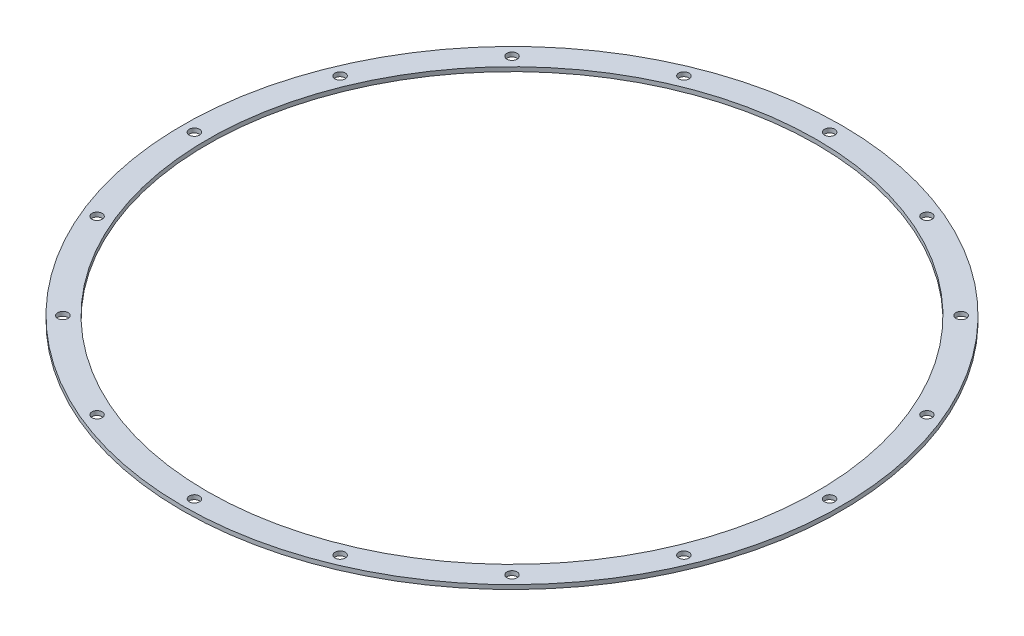
ISO-10303-21;
HEADER;
FILE_DESCRIPTION(('STEP AP214'),'2;1');
FILE_NAME('part.step','',(''),(''),'','','');
FILE_SCHEMA(('AUTOMOTIVE_DESIGN { 1 0 10303 214 1 1 1 1 }'));
ENDSEC;
DATA;
#1=APPLICATION_CONTEXT('core data for automotive mechanical design processes');
#2=APPLICATION_PROTOCOL_DEFINITION('international standard','automotive_design',2000,#1);
#3=PRODUCT_CONTEXT('',#1,'mechanical');
#4=PRODUCT('Part','Part','',(#3));
#5=PRODUCT_RELATED_PRODUCT_CATEGORY('part','',(#4));
#6=PRODUCT_DEFINITION_FORMATION('','',#4);
#7=PRODUCT_DEFINITION_CONTEXT('part definition',#1,'design');
#8=PRODUCT_DEFINITION('design','',#6,#7);
#9=PRODUCT_DEFINITION_SHAPE('','',#8);
#10=(LENGTH_UNIT() NAMED_UNIT(*) SI_UNIT(.MILLI.,.METRE.));
#11=(NAMED_UNIT(*) PLANE_ANGLE_UNIT() SI_UNIT($,.RADIAN.));
#12=(NAMED_UNIT(*) SI_UNIT($,.STERADIAN.) SOLID_ANGLE_UNIT());
#13=UNCERTAINTY_MEASURE_WITH_UNIT(LENGTH_MEASURE(1.E-05),#10,'distance_accuracy_value','');
#14=(GEOMETRIC_REPRESENTATION_CONTEXT(3) GLOBAL_UNCERTAINTY_ASSIGNED_CONTEXT((#13)) GLOBAL_UNIT_ASSIGNED_CONTEXT((#10,
#11,#12)) REPRESENTATION_CONTEXT('',''));
#15=CARTESIAN_POINT('',(0.,0.,0.));
#16=DIRECTION('',(0.,0.,1.));
#17=DIRECTION('',(1.,0.,0.));
#18=AXIS2_PLACEMENT_3D('',#15,#16,#17);
#19=CARTESIAN_POINT('',(0.,2.5,0.));
#20=DIRECTION('',(0.,1.,0.));
#21=DIRECTION('',(0.,0.,1.));
#22=AXIS2_PLACEMENT_3D('',#19,#20,#21);
#23=PLANE('',#22);
#24=CARTESIAN_POINT('',(-262.690169210806,2.5,262.690169210799));
#25=DIRECTION('',(0.,1.,0.));
#26=DIRECTION('',(0.,0.,1.));
#27=AXIS2_PLACEMENT_3D('',#24,#25,#26);
#28=CIRCLE('',#27,5.99999999999999);
#29=CARTESIAN_POINT('',(-262.690169210806,2.5,268.690169210799));
#30=VERTEX_POINT('',#29);
#31=EDGE_CURVE('E133',#30,#30,#28,.T.);
#32=ORIENTED_EDGE('',*,*,#31,.F.);
#33=EDGE_LOOP('',(#32));
#34=FACE_BOUND('',#33,.T.);
#35=CARTESIAN_POINT('',(-3.89125595214067E-12,2.5,371.5));
#36=DIRECTION('',(0.,1.,0.));
#37=DIRECTION('',(0.,0.,1.));
#38=AXIS2_PLACEMENT_3D('',#35,#36,#37);
#39=CIRCLE('',#38,5.99999999999997);
#40=CARTESIAN_POINT('',(-3.89125595214067E-12,2.5,377.5));
#41=VERTEX_POINT('',#40);
#42=EDGE_CURVE('E121',#41,#41,#39,.T.);
#43=ORIENTED_EDGE('',*,*,#42,.F.);
#44=EDGE_LOOP('',(#43));
#45=FACE_BOUND('',#44,.T.);
#46=CARTESIAN_POINT('',(262.6901692108,2.5,262.690169210805));
#47=DIRECTION('',(0.,1.,0.));
#48=DIRECTION('',(0.,0.,1.));
#49=AXIS2_PLACEMENT_3D('',#46,#47,#48);
#50=CIRCLE('',#49,5.99999999999998);
#51=CARTESIAN_POINT('',(262.6901692108,2.5,268.690169210805));
#52=VERTEX_POINT('',#51);
#53=EDGE_CURVE('E109',#52,#52,#50,.T.);
#54=ORIENTED_EDGE('',*,*,#53,.F.);
#55=EDGE_LOOP('',(#54));
#56=FACE_BOUND('',#55,.T.);
#57=CARTESIAN_POINT('',(371.5,2.5,2.59417063476045E-12));
#58=DIRECTION('',(0.,1.,0.));
#59=DIRECTION('',(0.,0.,1.));
#60=AXIS2_PLACEMENT_3D('',#57,#58,#59);
#61=CIRCLE('',#60,5.99999999999998);
#62=CARTESIAN_POINT('',(371.5,2.5,6.00000000000257));
#63=VERTEX_POINT('',#62);
#64=EDGE_CURVE('E97',#63,#63,#61,.T.);
#65=ORIENTED_EDGE('',*,*,#64,.F.);
#66=EDGE_LOOP('',(#65));
#67=FACE_BOUND('',#66,.T.);
#68=CARTESIAN_POINT('',(262.690169210804,2.5,-262.690169210801));
#69=DIRECTION('',(0.,1.,0.));
#70=DIRECTION('',(0.,0.,1.));
#71=AXIS2_PLACEMENT_3D('',#68,#69,#70);
#72=CIRCLE('',#71,5.99999999999998);
#73=CARTESIAN_POINT('',(262.690169210804,2.5,-256.690169210801));
#74=VERTEX_POINT('',#73);
#75=EDGE_CURVE('E85',#74,#74,#72,.T.);
#76=ORIENTED_EDGE('',*,*,#75,.F.);
#77=EDGE_LOOP('',(#76));
#78=FACE_BOUND('',#77,.T.);
#79=CARTESIAN_POINT('',(1.29708531738022E-12,2.5,-371.5));
#80=DIRECTION('',(0.,1.,0.));
#81=DIRECTION('',(0.,0.,1.));
#82=AXIS2_PLACEMENT_3D('',#79,#80,#81);
#83=CIRCLE('',#82,5.99999999999998);
#84=CARTESIAN_POINT('',(1.29708531738022E-12,2.5,-365.5));
#85=VERTEX_POINT('',#84);
#86=EDGE_CURVE('E73',#85,#85,#83,.T.);
#87=ORIENTED_EDGE('',*,*,#86,.F.);
#88=EDGE_LOOP('',(#87));
#89=FACE_BOUND('',#88,.T.);
#90=CARTESIAN_POINT('',(-262.690169210802,2.5,-262.690169210803));
#91=DIRECTION('',(0.,1.,0.));
#92=DIRECTION('',(0.,0.,1.));
#93=AXIS2_PLACEMENT_3D('',#90,#91,#92);
#94=CIRCLE('',#93,5.99999999999996);
#95=CARTESIAN_POINT('',(-262.690169210802,2.5,-256.690169210803));
#96=VERTEX_POINT('',#95);
#97=EDGE_CURVE('E61',#96,#96,#94,.T.);
#98=ORIENTED_EDGE('',*,*,#97,.F.);
#99=EDGE_LOOP('',(#98));
#100=FACE_BOUND('',#99,.T.);
#101=CARTESIAN_POINT('',(-371.5,2.5,0.));
#102=DIRECTION('',(0.,1.,0.));
#103=DIRECTION('',(0.,0.,1.));
#104=AXIS2_PLACEMENT_3D('',#101,#102,#103);
#105=CIRCLE('',#104,5.99999999999999);
#106=CARTESIAN_POINT('',(-371.5,2.5,5.99999999999999));
#107=VERTEX_POINT('',#106);
#108=EDGE_CURVE('E49',#107,#107,#105,.T.);
#109=ORIENTED_EDGE('',*,*,#108,.F.);
#110=EDGE_LOOP('',(#109));
#111=FACE_BOUND('',#110,.T.);
#112=CARTESIAN_POINT('',(0.,2.5,0.));
#113=DIRECTION('',(0.,1.,0.));
#114=DIRECTION('',(0.,0.,1.));
#115=AXIS2_PLACEMENT_3D('',#112,#113,#114);
#116=CIRCLE('',#115,385.5);
#117=CARTESIAN_POINT('',(0.,2.5,385.5));
#118=VERTEX_POINT('',#117);
#119=EDGE_CURVE('E10',#118,#118,#116,.T.);
#120=ORIENTED_EDGE('',*,*,#119,.T.);
#121=EDGE_LOOP('',(#120));
#122=FACE_BOUND('',#121,.T.);
#123=CARTESIAN_POINT('',(0.,2.5,0.));
#124=DIRECTION('',(0.,1.,0.));
#125=DIRECTION('',(0.,0.,1.));
#126=AXIS2_PLACEMENT_3D('',#123,#124,#125);
#127=CIRCLE('',#126,356.5);
#128=CARTESIAN_POINT('',(0.,2.5,356.5));
#129=VERTEX_POINT('',#128);
#130=EDGE_CURVE('E44',#129,#129,#127,.T.);
#131=ORIENTED_EDGE('',*,*,#130,.F.);
#132=EDGE_LOOP('',(#131));
#133=FACE_BOUND('',#132,.T.);
#134=CARTESIAN_POINT('',(-343.221246327943,2.5,-142.166895123631));
#135=DIRECTION('',(0.,1.,0.));
#136=DIRECTION('',(0.,0.,1.));
#137=AXIS2_PLACEMENT_3D('',#134,#135,#136);
#138=CIRCLE('',#137,5.99999999999998);
#139=CARTESIAN_POINT('',(-343.221246327943,2.5,-136.166895123631));
#140=VERTEX_POINT('',#139);
#141=EDGE_CURVE('E55',#140,#140,#138,.T.);
#142=ORIENTED_EDGE('',*,*,#141,.F.);
#143=EDGE_LOOP('',(#142));
#144=FACE_BOUND('',#143,.T.);
#145=CARTESIAN_POINT('',(-142.16689512363,2.5,-343.221246327943));
#146=DIRECTION('',(0.,1.,0.));
#147=DIRECTION('',(0.,0.,1.));
#148=AXIS2_PLACEMENT_3D('',#145,#146,#147);
#149=CIRCLE('',#148,5.99999999999998);
#150=CARTESIAN_POINT('',(-142.16689512363,2.5,-337.221246327943));
#151=VERTEX_POINT('',#150);
#152=EDGE_CURVE('E67',#151,#151,#149,.T.);
#153=ORIENTED_EDGE('',*,*,#152,.F.);
#154=EDGE_LOOP('',(#153));
#155=FACE_BOUND('',#154,.T.);
#156=CARTESIAN_POINT('',(142.166895123632,2.5,-343.221246327942));
#157=DIRECTION('',(0.,1.,0.));
#158=DIRECTION('',(0.,0.,1.));
#159=AXIS2_PLACEMENT_3D('',#156,#157,#158);
#160=CIRCLE('',#159,5.99999999999998);
#161=CARTESIAN_POINT('',(142.166895123632,2.5,-337.221246327942));
#162=VERTEX_POINT('',#161);
#163=EDGE_CURVE('E79',#162,#162,#160,.T.);
#164=ORIENTED_EDGE('',*,*,#163,.F.);
#165=EDGE_LOOP('',(#164));
#166=FACE_BOUND('',#165,.T.);
#167=CARTESIAN_POINT('',(343.221246327944,2.5,-142.166895123629));
#168=DIRECTION('',(0.,1.,0.));
#169=DIRECTION('',(0.,0.,1.));
#170=AXIS2_PLACEMENT_3D('',#167,#168,#169);
#171=CIRCLE('',#170,5.99999999999998);
#172=CARTESIAN_POINT('',(343.221246327944,2.5,-136.166895123629));
#173=VERTEX_POINT('',#172);
#174=EDGE_CURVE('E91',#173,#173,#171,.T.);
#175=ORIENTED_EDGE('',*,*,#174,.F.);
#176=EDGE_LOOP('',(#175));
#177=FACE_BOUND('',#176,.T.);
#178=CARTESIAN_POINT('',(343.221246327942,2.5,142.166895123634));
#179=DIRECTION('',(0.,1.,0.));
#180=DIRECTION('',(0.,0.,1.));
#181=AXIS2_PLACEMENT_3D('',#178,#179,#180);
#182=CIRCLE('',#181,5.99999999999998);
#183=CARTESIAN_POINT('',(343.221246327942,2.5,148.166895123634));
#184=VERTEX_POINT('',#183);
#185=EDGE_CURVE('E103',#184,#184,#182,.T.);
#186=ORIENTED_EDGE('',*,*,#185,.F.);
#187=EDGE_LOOP('',(#186));
#188=FACE_BOUND('',#187,.T.);
#189=CARTESIAN_POINT('',(142.166895123627,2.5,343.221246327944));
#190=DIRECTION('',(0.,1.,0.));
#191=DIRECTION('',(0.,0.,1.));
#192=AXIS2_PLACEMENT_3D('',#189,#190,#191);
#193=CIRCLE('',#192,6.);
#194=CARTESIAN_POINT('',(142.166895123627,2.5,349.221246327944));
#195=VERTEX_POINT('',#194);
#196=EDGE_CURVE('E115',#195,#195,#193,.T.);
#197=ORIENTED_EDGE('',*,*,#196,.F.);
#198=EDGE_LOOP('',(#197));
#199=FACE_BOUND('',#198,.T.);
#200=CARTESIAN_POINT('',(-142.166895123635,2.5,343.221246327942));
#201=DIRECTION('',(0.,1.,0.));
#202=DIRECTION('',(0.,0.,1.));
#203=AXIS2_PLACEMENT_3D('',#200,#201,#202);
#204=CIRCLE('',#203,5.99999999999998);
#205=CARTESIAN_POINT('',(-142.166895123635,2.5,349.221246327942));
#206=VERTEX_POINT('',#205);
#207=EDGE_CURVE('E127',#206,#206,#204,.T.);
#208=ORIENTED_EDGE('',*,*,#207,.F.);
#209=EDGE_LOOP('',(#208));
#210=FACE_BOUND('',#209,.T.);
#211=CARTESIAN_POINT('',(-343.221246327945,2.5,142.166895123626));
#212=DIRECTION('',(0.,1.,0.));
#213=DIRECTION('',(0.,0.,1.));
#214=AXIS2_PLACEMENT_3D('',#211,#212,#213);
#215=CIRCLE('',#214,5.99999999999998);
#216=CARTESIAN_POINT('',(-343.221246327945,2.5,148.166895123626));
#217=VERTEX_POINT('',#216);
#218=EDGE_CURVE('E139',#217,#217,#215,.T.);
#219=ORIENTED_EDGE('',*,*,#218,.F.);
#220=EDGE_LOOP('',(#219));
#221=FACE_BOUND('',#220,.T.);
#222=ADVANCED_FACE('F33',(#34,#45,#56,#67,#78,#89,#100,#111,#122,#133,#144,#155,#166,#177,#188,
#199,#210,#221),#23,.T.);
#223=CARTESIAN_POINT('',(0.,-2.5,0.));
#224=DIRECTION('',(0.,1.,0.));
#225=DIRECTION('',(0.,0.,1.));
#226=AXIS2_PLACEMENT_3D('',#223,#224,#225);
#227=PLANE('',#226);
#228=CARTESIAN_POINT('',(0.,-2.5,0.));
#229=DIRECTION('',(0.,1.,0.));
#230=DIRECTION('',(0.,0.,1.));
#231=AXIS2_PLACEMENT_3D('',#228,#229,#230);
#232=CIRCLE('',#231,385.5);
#233=CARTESIAN_POINT('',(0.,-2.5,385.5));
#234=VERTEX_POINT('',#233);
#235=EDGE_CURVE('E37',#234,#234,#232,.T.);
#236=ORIENTED_EDGE('',*,*,#235,.F.);
#237=EDGE_LOOP('',(#236));
#238=FACE_BOUND('',#237,.T.);
#239=CARTESIAN_POINT('',(0.,-2.5,0.));
#240=DIRECTION('',(0.,1.,0.));
#241=DIRECTION('',(0.,0.,1.));
#242=AXIS2_PLACEMENT_3D('',#239,#240,#241);
#243=CIRCLE('',#242,356.5);
#244=CARTESIAN_POINT('',(0.,-2.5,356.5));
#245=VERTEX_POINT('',#244);
#246=EDGE_CURVE('E46',#245,#245,#243,.T.);
#247=ORIENTED_EDGE('',*,*,#246,.T.);
#248=EDGE_LOOP('',(#247));
#249=FACE_BOUND('',#248,.T.);
#250=CARTESIAN_POINT('',(-371.5,-2.5,0.));
#251=DIRECTION('',(0.,1.,0.));
#252=DIRECTION('',(0.,0.,1.));
#253=AXIS2_PLACEMENT_3D('',#250,#251,#252);
#254=CIRCLE('',#253,5.99999999999999);
#255=CARTESIAN_POINT('',(-371.5,-2.5,5.99999999999999));
#256=VERTEX_POINT('',#255);
#257=EDGE_CURVE('E52',#256,#256,#254,.T.);
#258=ORIENTED_EDGE('',*,*,#257,.T.);
#259=EDGE_LOOP('',(#258));
#260=FACE_BOUND('',#259,.T.);
#261=CARTESIAN_POINT('',(-343.221246327943,-2.5,-142.166895123631));
#262=DIRECTION('',(0.,1.,0.));
#263=DIRECTION('',(0.,0.,1.));
#264=AXIS2_PLACEMENT_3D('',#261,#262,#263);
#265=CIRCLE('',#264,5.99999999999998);
#266=CARTESIAN_POINT('',(-343.221246327943,-2.5,-136.166895123631));
#267=VERTEX_POINT('',#266);
#268=EDGE_CURVE('E58',#267,#267,#265,.T.);
#269=ORIENTED_EDGE('',*,*,#268,.T.);
#270=EDGE_LOOP('',(#269));
#271=FACE_BOUND('',#270,.T.);
#272=CARTESIAN_POINT('',(-262.690169210802,-2.5,-262.690169210803));
#273=DIRECTION('',(0.,1.,0.));
#274=DIRECTION('',(0.,0.,1.));
#275=AXIS2_PLACEMENT_3D('',#272,#273,#274);
#276=CIRCLE('',#275,5.99999999999996);
#277=CARTESIAN_POINT('',(-262.690169210802,-2.5,-256.690169210803));
#278=VERTEX_POINT('',#277);
#279=EDGE_CURVE('E64',#278,#278,#276,.T.);
#280=ORIENTED_EDGE('',*,*,#279,.T.);
#281=EDGE_LOOP('',(#280));
#282=FACE_BOUND('',#281,.T.);
#283=CARTESIAN_POINT('',(-142.16689512363,-2.5,-343.221246327943));
#284=DIRECTION('',(0.,1.,0.));
#285=DIRECTION('',(0.,0.,1.));
#286=AXIS2_PLACEMENT_3D('',#283,#284,#285);
#287=CIRCLE('',#286,5.99999999999998);
#288=CARTESIAN_POINT('',(-142.16689512363,-2.5,-337.221246327943));
#289=VERTEX_POINT('',#288);
#290=EDGE_CURVE('E70',#289,#289,#287,.T.);
#291=ORIENTED_EDGE('',*,*,#290,.T.);
#292=EDGE_LOOP('',(#291));
#293=FACE_BOUND('',#292,.T.);
#294=CARTESIAN_POINT('',(1.29708531738022E-12,-2.5,-371.5));
#295=DIRECTION('',(0.,1.,0.));
#296=DIRECTION('',(0.,0.,1.));
#297=AXIS2_PLACEMENT_3D('',#294,#295,#296);
#298=CIRCLE('',#297,5.99999999999998);
#299=CARTESIAN_POINT('',(1.29708531738022E-12,-2.5,-365.5));
#300=VERTEX_POINT('',#299);
#301=EDGE_CURVE('E76',#300,#300,#298,.T.);
#302=ORIENTED_EDGE('',*,*,#301,.T.);
#303=EDGE_LOOP('',(#302));
#304=FACE_BOUND('',#303,.T.);
#305=CARTESIAN_POINT('',(142.166895123632,-2.5,-343.221246327942));
#306=DIRECTION('',(0.,1.,0.));
#307=DIRECTION('',(0.,0.,1.));
#308=AXIS2_PLACEMENT_3D('',#305,#306,#307);
#309=CIRCLE('',#308,5.99999999999998);
#310=CARTESIAN_POINT('',(142.166895123632,-2.5,-337.221246327942));
#311=VERTEX_POINT('',#310);
#312=EDGE_CURVE('E82',#311,#311,#309,.T.);
#313=ORIENTED_EDGE('',*,*,#312,.T.);
#314=EDGE_LOOP('',(#313));
#315=FACE_BOUND('',#314,.T.);
#316=CARTESIAN_POINT('',(262.690169210804,-2.5,-262.690169210801));
#317=DIRECTION('',(0.,1.,0.));
#318=DIRECTION('',(0.,0.,1.));
#319=AXIS2_PLACEMENT_3D('',#316,#317,#318);
#320=CIRCLE('',#319,5.99999999999998);
#321=CARTESIAN_POINT('',(262.690169210804,-2.5,-256.690169210801));
#322=VERTEX_POINT('',#321);
#323=EDGE_CURVE('E88',#322,#322,#320,.T.);
#324=ORIENTED_EDGE('',*,*,#323,.T.);
#325=EDGE_LOOP('',(#324));
#326=FACE_BOUND('',#325,.T.);
#327=CARTESIAN_POINT('',(343.221246327944,-2.5,-142.166895123629));
#328=DIRECTION('',(0.,1.,0.));
#329=DIRECTION('',(0.,0.,1.));
#330=AXIS2_PLACEMENT_3D('',#327,#328,#329);
#331=CIRCLE('',#330,5.99999999999998);
#332=CARTESIAN_POINT('',(343.221246327944,-2.5,-136.166895123629));
#333=VERTEX_POINT('',#332);
#334=EDGE_CURVE('E94',#333,#333,#331,.T.);
#335=ORIENTED_EDGE('',*,*,#334,.T.);
#336=EDGE_LOOP('',(#335));
#337=FACE_BOUND('',#336,.T.);
#338=CARTESIAN_POINT('',(371.5,-2.5,2.59417063476045E-12));
#339=DIRECTION('',(0.,1.,0.));
#340=DIRECTION('',(0.,0.,1.));
#341=AXIS2_PLACEMENT_3D('',#338,#339,#340);
#342=CIRCLE('',#341,5.99999999999998);
#343=CARTESIAN_POINT('',(371.5,-2.5,6.00000000000257));
#344=VERTEX_POINT('',#343);
#345=EDGE_CURVE('E100',#344,#344,#342,.T.);
#346=ORIENTED_EDGE('',*,*,#345,.T.);
#347=EDGE_LOOP('',(#346));
#348=FACE_BOUND('',#347,.T.);
#349=CARTESIAN_POINT('',(343.221246327942,-2.5,142.166895123634));
#350=DIRECTION('',(0.,1.,0.));
#351=DIRECTION('',(0.,0.,1.));
#352=AXIS2_PLACEMENT_3D('',#349,#350,#351);
#353=CIRCLE('',#352,5.99999999999998);
#354=CARTESIAN_POINT('',(343.221246327942,-2.5,148.166895123634));
#355=VERTEX_POINT('',#354);
#356=EDGE_CURVE('E106',#355,#355,#353,.T.);
#357=ORIENTED_EDGE('',*,*,#356,.T.);
#358=EDGE_LOOP('',(#357));
#359=FACE_BOUND('',#358,.T.);
#360=CARTESIAN_POINT('',(262.6901692108,-2.5,262.690169210805));
#361=DIRECTION('',(0.,1.,0.));
#362=DIRECTION('',(0.,0.,1.));
#363=AXIS2_PLACEMENT_3D('',#360,#361,#362);
#364=CIRCLE('',#363,5.99999999999998);
#365=CARTESIAN_POINT('',(262.6901692108,-2.5,268.690169210805));
#366=VERTEX_POINT('',#365);
#367=EDGE_CURVE('E112',#366,#366,#364,.T.);
#368=ORIENTED_EDGE('',*,*,#367,.T.);
#369=EDGE_LOOP('',(#368));
#370=FACE_BOUND('',#369,.T.);
#371=CARTESIAN_POINT('',(142.166895123627,-2.5,343.221246327944));
#372=DIRECTION('',(0.,1.,0.));
#373=DIRECTION('',(0.,0.,1.));
#374=AXIS2_PLACEMENT_3D('',#371,#372,#373);
#375=CIRCLE('',#374,6.);
#376=CARTESIAN_POINT('',(142.166895123627,-2.5,349.221246327944));
#377=VERTEX_POINT('',#376);
#378=EDGE_CURVE('E118',#377,#377,#375,.T.);
#379=ORIENTED_EDGE('',*,*,#378,.T.);
#380=EDGE_LOOP('',(#379));
#381=FACE_BOUND('',#380,.T.);
#382=CARTESIAN_POINT('',(-3.89125595214067E-12,-2.5,371.5));
#383=DIRECTION('',(0.,1.,0.));
#384=DIRECTION('',(0.,0.,1.));
#385=AXIS2_PLACEMENT_3D('',#382,#383,#384);
#386=CIRCLE('',#385,5.99999999999997);
#387=CARTESIAN_POINT('',(-3.89125595214067E-12,-2.5,377.5));
#388=VERTEX_POINT('',#387);
#389=EDGE_CURVE('E124',#388,#388,#386,.T.);
#390=ORIENTED_EDGE('',*,*,#389,.T.);
#391=EDGE_LOOP('',(#390));
#392=FACE_BOUND('',#391,.T.);
#393=CARTESIAN_POINT('',(-142.166895123635,-2.5,343.221246327942));
#394=DIRECTION('',(0.,1.,0.));
#395=DIRECTION('',(0.,0.,1.));
#396=AXIS2_PLACEMENT_3D('',#393,#394,#395);
#397=CIRCLE('',#396,5.99999999999998);
#398=CARTESIAN_POINT('',(-142.166895123635,-2.5,349.221246327942));
#399=VERTEX_POINT('',#398);
#400=EDGE_CURVE('E130',#399,#399,#397,.T.);
#401=ORIENTED_EDGE('',*,*,#400,.T.);
#402=EDGE_LOOP('',(#401));
#403=FACE_BOUND('',#402,.T.);
#404=CARTESIAN_POINT('',(-262.690169210806,-2.5,262.690169210799));
#405=DIRECTION('',(0.,1.,0.));
#406=DIRECTION('',(0.,0.,1.));
#407=AXIS2_PLACEMENT_3D('',#404,#405,#406);
#408=CIRCLE('',#407,5.99999999999999);
#409=CARTESIAN_POINT('',(-262.690169210806,-2.5,268.690169210799));
#410=VERTEX_POINT('',#409);
#411=EDGE_CURVE('E136',#410,#410,#408,.T.);
#412=ORIENTED_EDGE('',*,*,#411,.T.);
#413=EDGE_LOOP('',(#412));
#414=FACE_BOUND('',#413,.T.);
#415=CARTESIAN_POINT('',(-343.221246327945,-2.5,142.166895123626));
#416=DIRECTION('',(0.,1.,0.));
#417=DIRECTION('',(0.,0.,1.));
#418=AXIS2_PLACEMENT_3D('',#415,#416,#417);
#419=CIRCLE('',#418,5.99999999999998);
#420=CARTESIAN_POINT('',(-343.221246327945,-2.5,148.166895123626));
#421=VERTEX_POINT('',#420);
#422=EDGE_CURVE('E142',#421,#421,#419,.T.);
#423=ORIENTED_EDGE('',*,*,#422,.T.);
#424=EDGE_LOOP('',(#423));
#425=FACE_BOUND('',#424,.T.);
#426=ADVANCED_FACE('F152',(#238,#249,#260,#271,#282,#293,#304,#315,#326,#337,#348,#359,#370,
#381,#392,#403,#414,#425),#227,.F.);
#427=CARTESIAN_POINT('',(0.,2.5,0.));
#428=DIRECTION('',(0.,-1.,0.));
#429=DIRECTION('',(0.,0.,-1.));
#430=AXIS2_PLACEMENT_3D('',#427,#428,#429);
#431=CYLINDRICAL_SURFACE('',#430,385.5);
#432=ORIENTED_EDGE('',*,*,#119,.F.);
#433=EDGE_LOOP('',(#432));
#434=FACE_BOUND('',#433,.T.);
#435=ORIENTED_EDGE('',*,*,#235,.T.);
#436=EDGE_LOOP('',(#435));
#437=FACE_BOUND('',#436,.T.);
#438=ADVANCED_FACE('F35',(#434,#437),#431,.T.);
#439=CARTESIAN_POINT('',(0.,2.5,0.));
#440=DIRECTION('',(0.,-1.,0.));
#441=DIRECTION('',(0.,0.,-1.));
#442=AXIS2_PLACEMENT_3D('',#439,#440,#441);
#443=CYLINDRICAL_SURFACE('',#442,356.5);
#444=ORIENTED_EDGE('',*,*,#130,.T.);
#445=EDGE_LOOP('',(#444));
#446=FACE_BOUND('',#445,.T.);
#447=ORIENTED_EDGE('',*,*,#246,.F.);
#448=EDGE_LOOP('',(#447));
#449=FACE_BOUND('',#448,.T.);
#450=ADVANCED_FACE('F162',(#446,#449),#443,.F.);
#451=CARTESIAN_POINT('',(-371.5,2.5,0.));
#452=DIRECTION('',(0.,-1.,0.));
#453=DIRECTION('',(0.,0.,-1.));
#454=AXIS2_PLACEMENT_3D('',#451,#452,#453);
#455=CYLINDRICAL_SURFACE('',#454,5.99999999999999);
#456=ORIENTED_EDGE('',*,*,#108,.T.);
#457=EDGE_LOOP('',(#456));
#458=FACE_BOUND('',#457,.T.);
#459=ORIENTED_EDGE('',*,*,#257,.F.);
#460=EDGE_LOOP('',(#459));
#461=FACE_BOUND('',#460,.T.);
#462=ADVANCED_FACE('F165',(#458,#461),#455,.F.);
#463=CARTESIAN_POINT('',(-343.221246327943,2.5,-142.166895123631));
#464=DIRECTION('',(0.,-1.,0.));
#465=DIRECTION('',(0.,0.,-1.));
#466=AXIS2_PLACEMENT_3D('',#463,#464,#465);
#467=CYLINDRICAL_SURFACE('',#466,5.99999999999998);
#468=ORIENTED_EDGE('',*,*,#141,.T.);
#469=EDGE_LOOP('',(#468));
#470=FACE_BOUND('',#469,.T.);
#471=ORIENTED_EDGE('',*,*,#268,.F.);
#472=EDGE_LOOP('',(#471));
#473=FACE_BOUND('',#472,.T.);
#474=ADVANCED_FACE('F169',(#470,#473),#467,.F.);
#475=CARTESIAN_POINT('',(-262.690169210802,2.5,-262.690169210803));
#476=DIRECTION('',(0.,-1.,0.));
#477=DIRECTION('',(0.,0.,-1.));
#478=AXIS2_PLACEMENT_3D('',#475,#476,#477);
#479=CYLINDRICAL_SURFACE('',#478,5.99999999999996);
#480=ORIENTED_EDGE('',*,*,#97,.T.);
#481=EDGE_LOOP('',(#480));
#482=FACE_BOUND('',#481,.T.);
#483=ORIENTED_EDGE('',*,*,#279,.F.);
#484=EDGE_LOOP('',(#483));
#485=FACE_BOUND('',#484,.T.);
#486=ADVANCED_FACE('F173',(#482,#485),#479,.F.);
#487=CARTESIAN_POINT('',(-142.16689512363,2.5,-343.221246327943));
#488=DIRECTION('',(0.,-1.,0.));
#489=DIRECTION('',(0.,0.,-1.));
#490=AXIS2_PLACEMENT_3D('',#487,#488,#489);
#491=CYLINDRICAL_SURFACE('',#490,5.99999999999998);
#492=ORIENTED_EDGE('',*,*,#152,.T.);
#493=EDGE_LOOP('',(#492));
#494=FACE_BOUND('',#493,.T.);
#495=ORIENTED_EDGE('',*,*,#290,.F.);
#496=EDGE_LOOP('',(#495));
#497=FACE_BOUND('',#496,.T.);
#498=ADVANCED_FACE('F177',(#494,#497),#491,.F.);
#499=CARTESIAN_POINT('',(1.29708531738022E-12,2.5,-371.5));
#500=DIRECTION('',(0.,-1.,0.));
#501=DIRECTION('',(0.,0.,-1.));
#502=AXIS2_PLACEMENT_3D('',#499,#500,#501);
#503=CYLINDRICAL_SURFACE('',#502,5.99999999999998);
#504=ORIENTED_EDGE('',*,*,#86,.T.);
#505=EDGE_LOOP('',(#504));
#506=FACE_BOUND('',#505,.T.);
#507=ORIENTED_EDGE('',*,*,#301,.F.);
#508=EDGE_LOOP('',(#507));
#509=FACE_BOUND('',#508,.T.);
#510=ADVANCED_FACE('F181',(#506,#509),#503,.F.);
#511=CARTESIAN_POINT('',(142.166895123632,2.5,-343.221246327942));
#512=DIRECTION('',(0.,-1.,0.));
#513=DIRECTION('',(0.,0.,-1.));
#514=AXIS2_PLACEMENT_3D('',#511,#512,#513);
#515=CYLINDRICAL_SURFACE('',#514,5.99999999999998);
#516=ORIENTED_EDGE('',*,*,#163,.T.);
#517=EDGE_LOOP('',(#516));
#518=FACE_BOUND('',#517,.T.);
#519=ORIENTED_EDGE('',*,*,#312,.F.);
#520=EDGE_LOOP('',(#519));
#521=FACE_BOUND('',#520,.T.);
#522=ADVANCED_FACE('F185',(#518,#521),#515,.F.);
#523=CARTESIAN_POINT('',(262.690169210804,2.5,-262.690169210801));
#524=DIRECTION('',(0.,-1.,0.));
#525=DIRECTION('',(0.,0.,-1.));
#526=AXIS2_PLACEMENT_3D('',#523,#524,#525);
#527=CYLINDRICAL_SURFACE('',#526,5.99999999999998);
#528=ORIENTED_EDGE('',*,*,#75,.T.);
#529=EDGE_LOOP('',(#528));
#530=FACE_BOUND('',#529,.T.);
#531=ORIENTED_EDGE('',*,*,#323,.F.);
#532=EDGE_LOOP('',(#531));
#533=FACE_BOUND('',#532,.T.);
#534=ADVANCED_FACE('F189',(#530,#533),#527,.F.);
#535=CARTESIAN_POINT('',(343.221246327944,2.5,-142.166895123629));
#536=DIRECTION('',(0.,-1.,0.));
#537=DIRECTION('',(0.,0.,-1.));
#538=AXIS2_PLACEMENT_3D('',#535,#536,#537);
#539=CYLINDRICAL_SURFACE('',#538,5.99999999999998);
#540=ORIENTED_EDGE('',*,*,#174,.T.);
#541=EDGE_LOOP('',(#540));
#542=FACE_BOUND('',#541,.T.);
#543=ORIENTED_EDGE('',*,*,#334,.F.);
#544=EDGE_LOOP('',(#543));
#545=FACE_BOUND('',#544,.T.);
#546=ADVANCED_FACE('F193',(#542,#545),#539,.F.);
#547=CARTESIAN_POINT('',(371.5,2.5,2.59417063476045E-12));
#548=DIRECTION('',(0.,-1.,0.));
#549=DIRECTION('',(0.,0.,-1.));
#550=AXIS2_PLACEMENT_3D('',#547,#548,#549);
#551=CYLINDRICAL_SURFACE('',#550,5.99999999999998);
#552=ORIENTED_EDGE('',*,*,#64,.T.);
#553=EDGE_LOOP('',(#552));
#554=FACE_BOUND('',#553,.T.);
#555=ORIENTED_EDGE('',*,*,#345,.F.);
#556=EDGE_LOOP('',(#555));
#557=FACE_BOUND('',#556,.T.);
#558=ADVANCED_FACE('F197',(#554,#557),#551,.F.);
#559=CARTESIAN_POINT('',(343.221246327942,2.5,142.166895123634));
#560=DIRECTION('',(0.,-1.,0.));
#561=DIRECTION('',(0.,0.,-1.));
#562=AXIS2_PLACEMENT_3D('',#559,#560,#561);
#563=CYLINDRICAL_SURFACE('',#562,5.99999999999998);
#564=ORIENTED_EDGE('',*,*,#185,.T.);
#565=EDGE_LOOP('',(#564));
#566=FACE_BOUND('',#565,.T.);
#567=ORIENTED_EDGE('',*,*,#356,.F.);
#568=EDGE_LOOP('',(#567));
#569=FACE_BOUND('',#568,.T.);
#570=ADVANCED_FACE('F201',(#566,#569),#563,.F.);
#571=CARTESIAN_POINT('',(262.6901692108,2.5,262.690169210805));
#572=DIRECTION('',(0.,-1.,0.));
#573=DIRECTION('',(0.,0.,-1.));
#574=AXIS2_PLACEMENT_3D('',#571,#572,#573);
#575=CYLINDRICAL_SURFACE('',#574,5.99999999999998);
#576=ORIENTED_EDGE('',*,*,#53,.T.);
#577=EDGE_LOOP('',(#576));
#578=FACE_BOUND('',#577,.T.);
#579=ORIENTED_EDGE('',*,*,#367,.F.);
#580=EDGE_LOOP('',(#579));
#581=FACE_BOUND('',#580,.T.);
#582=ADVANCED_FACE('F205',(#578,#581),#575,.F.);
#583=CARTESIAN_POINT('',(142.166895123627,2.5,343.221246327944));
#584=DIRECTION('',(0.,-1.,0.));
#585=DIRECTION('',(0.,0.,-1.));
#586=AXIS2_PLACEMENT_3D('',#583,#584,#585);
#587=CYLINDRICAL_SURFACE('',#586,6.);
#588=ORIENTED_EDGE('',*,*,#196,.T.);
#589=EDGE_LOOP('',(#588));
#590=FACE_BOUND('',#589,.T.);
#591=ORIENTED_EDGE('',*,*,#378,.F.);
#592=EDGE_LOOP('',(#591));
#593=FACE_BOUND('',#592,.T.);
#594=ADVANCED_FACE('F209',(#590,#593),#587,.F.);
#595=CARTESIAN_POINT('',(-3.89125595214067E-12,2.5,371.5));
#596=DIRECTION('',(0.,-1.,0.));
#597=DIRECTION('',(0.,0.,-1.));
#598=AXIS2_PLACEMENT_3D('',#595,#596,#597);
#599=CYLINDRICAL_SURFACE('',#598,5.99999999999997);
#600=ORIENTED_EDGE('',*,*,#42,.T.);
#601=EDGE_LOOP('',(#600));
#602=FACE_BOUND('',#601,.T.);
#603=ORIENTED_EDGE('',*,*,#389,.F.);
#604=EDGE_LOOP('',(#603));
#605=FACE_BOUND('',#604,.T.);
#606=ADVANCED_FACE('F213',(#602,#605),#599,.F.);
#607=CARTESIAN_POINT('',(-142.166895123635,2.5,343.221246327942));
#608=DIRECTION('',(0.,-1.,0.));
#609=DIRECTION('',(0.,0.,-1.));
#610=AXIS2_PLACEMENT_3D('',#607,#608,#609);
#611=CYLINDRICAL_SURFACE('',#610,5.99999999999998);
#612=ORIENTED_EDGE('',*,*,#207,.T.);
#613=EDGE_LOOP('',(#612));
#614=FACE_BOUND('',#613,.T.);
#615=ORIENTED_EDGE('',*,*,#400,.F.);
#616=EDGE_LOOP('',(#615));
#617=FACE_BOUND('',#616,.T.);
#618=ADVANCED_FACE('F217',(#614,#617),#611,.F.);
#619=CARTESIAN_POINT('',(-262.690169210806,2.5,262.690169210799));
#620=DIRECTION('',(0.,-1.,0.));
#621=DIRECTION('',(0.,0.,-1.));
#622=AXIS2_PLACEMENT_3D('',#619,#620,#621);
#623=CYLINDRICAL_SURFACE('',#622,5.99999999999999);
#624=ORIENTED_EDGE('',*,*,#31,.T.);
#625=EDGE_LOOP('',(#624));
#626=FACE_BOUND('',#625,.T.);
#627=ORIENTED_EDGE('',*,*,#411,.F.);
#628=EDGE_LOOP('',(#627));
#629=FACE_BOUND('',#628,.T.);
#630=ADVANCED_FACE('F221',(#626,#629),#623,.F.);
#631=CARTESIAN_POINT('',(-343.221246327945,2.5,142.166895123626));
#632=DIRECTION('',(0.,-1.,0.));
#633=DIRECTION('',(0.,0.,-1.));
#634=AXIS2_PLACEMENT_3D('',#631,#632,#633);
#635=CYLINDRICAL_SURFACE('',#634,5.99999999999998);
#636=ORIENTED_EDGE('',*,*,#218,.T.);
#637=EDGE_LOOP('',(#636));
#638=FACE_BOUND('',#637,.T.);
#639=ORIENTED_EDGE('',*,*,#422,.F.);
#640=EDGE_LOOP('',(#639));
#641=FACE_BOUND('',#640,.T.);
#642=ADVANCED_FACE('F148',(#638,#641),#635,.F.);
#643=CLOSED_SHELL('',(#222,#426,#438,#450,#462,#474,#486,#498,#510,#522,#534,#546,#558,#570,
#582,#594,#606,#618,#630,#642));
#644=MANIFOLD_SOLID_BREP('B2',#643);
#645=ADVANCED_BREP_SHAPE_REPRESENTATION('',(#18,#644),#14);
#646=SHAPE_DEFINITION_REPRESENTATION(#9,#645);
ENDSEC;
END-ISO-10303-21;
